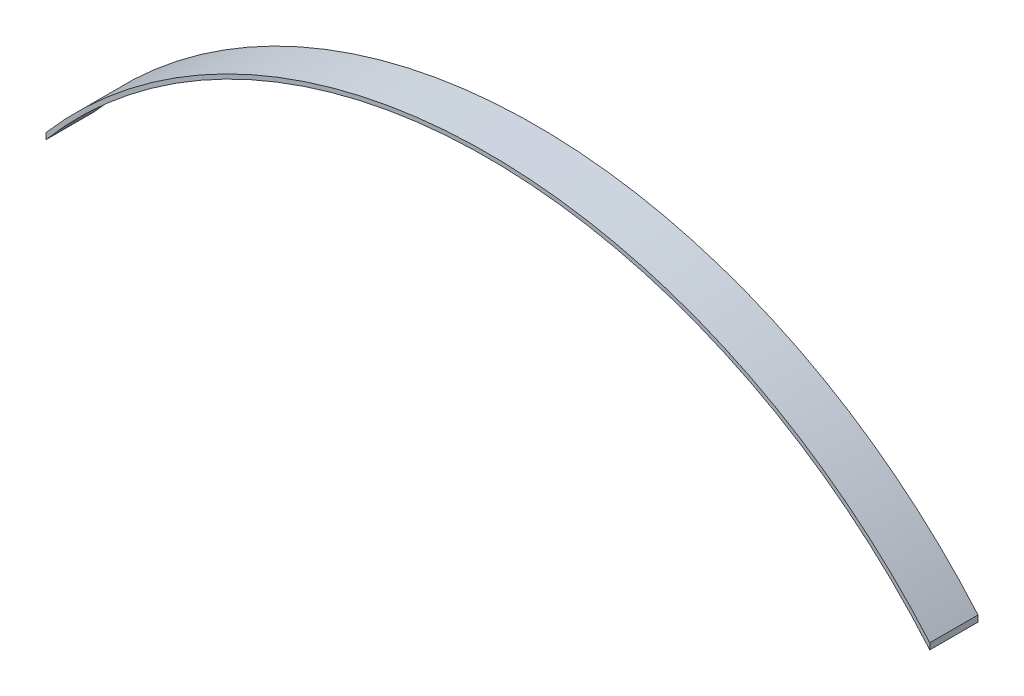
ISO-10303-21;
HEADER;
FILE_DESCRIPTION(('STEP AP214'),'2;1');
FILE_NAME('part.step','',(''),(''),'','','');
FILE_SCHEMA(('AUTOMOTIVE_DESIGN { 1 0 10303 214 1 1 1 1 }'));
ENDSEC;
DATA;
#1=APPLICATION_CONTEXT('core data for automotive mechanical design processes');
#2=APPLICATION_PROTOCOL_DEFINITION('international standard','automotive_design',2000,#1);
#3=PRODUCT_CONTEXT('',#1,'mechanical');
#4=PRODUCT('Part','Part','',(#3));
#5=PRODUCT_RELATED_PRODUCT_CATEGORY('part','',(#4));
#6=PRODUCT_DEFINITION_FORMATION('','',#4);
#7=PRODUCT_DEFINITION_CONTEXT('part definition',#1,'design');
#8=PRODUCT_DEFINITION('design','',#6,#7);
#9=PRODUCT_DEFINITION_SHAPE('','',#8);
#10=(LENGTH_UNIT() NAMED_UNIT(*) SI_UNIT(.MILLI.,.METRE.));
#11=(NAMED_UNIT(*) PLANE_ANGLE_UNIT() SI_UNIT($,.RADIAN.));
#12=(NAMED_UNIT(*) SI_UNIT($,.STERADIAN.) SOLID_ANGLE_UNIT());
#13=UNCERTAINTY_MEASURE_WITH_UNIT(LENGTH_MEASURE(1.E-05),#10,'distance_accuracy_value','');
#14=(GEOMETRIC_REPRESENTATION_CONTEXT(3) GLOBAL_UNCERTAINTY_ASSIGNED_CONTEXT((#13)) GLOBAL_UNIT_ASSIGNED_CONTEXT((#10,
#11,#12)) REPRESENTATION_CONTEXT('',''));
#15=CARTESIAN_POINT('',(0.,0.,0.));
#16=DIRECTION('',(0.,0.,1.));
#17=DIRECTION('',(1.,0.,0.));
#18=AXIS2_PLACEMENT_3D('',#15,#16,#17);
#19=CARTESIAN_POINT('',(0.,0.,12.));
#20=DIRECTION('',(0.,0.,-1.));
#21=DIRECTION('',(-1.,0.,0.));
#22=AXIS2_PLACEMENT_3D('',#19,#20,#21);
#23=CYLINDRICAL_SURFACE('',#22,145.);
#24=CARTESIAN_POINT('',(0.,0.,0.));
#25=DIRECTION('',(0.,0.,1.));
#26=DIRECTION('',(1.,0.,0.));
#27=AXIS2_PLACEMENT_3D('',#24,#25,#26);
#28=CIRCLE('',#27,145.);
#29=CARTESIAN_POINT('',(110.,94.4722181384559,0.));
#30=VERTEX_POINT('',#29);
#31=CARTESIAN_POINT('',(-110.,94.4722181384559,0.));
#32=VERTEX_POINT('',#31);
#33=EDGE_CURVE('E97',#30,#32,#28,.T.);
#34=ORIENTED_EDGE('',*,*,#33,.T.);
#35=DIRECTION('',(0.,0.,-1.));
#36=VECTOR('',#35,1.);
#37=CARTESIAN_POINT('',(-110.,94.4722181384559,12.));
#38=LINE('',#37,#36);
#39=CARTESIAN_POINT('',(-110.,94.4722181384559,12.));
#40=VERTEX_POINT('',#39);
#41=EDGE_CURVE('E11',#40,#32,#38,.T.);
#42=ORIENTED_EDGE('',*,*,#41,.F.);
#43=CARTESIAN_POINT('',(0.,0.,12.));
#44=DIRECTION('',(0.,0.,1.));
#45=DIRECTION('',(1.,0.,0.));
#46=AXIS2_PLACEMENT_3D('',#43,#44,#45);
#47=CIRCLE('',#46,145.);
#48=CARTESIAN_POINT('',(110.,94.4722181384559,12.));
#49=VERTEX_POINT('',#48);
#50=EDGE_CURVE('E85',#49,#40,#47,.T.);
#51=ORIENTED_EDGE('',*,*,#50,.F.);
#52=DIRECTION('',(0.,0.,-1.));
#53=VECTOR('',#52,1.);
#54=CARTESIAN_POINT('',(110.,94.4722181384559,12.));
#55=LINE('',#54,#53);
#56=EDGE_CURVE('E93',#49,#30,#55,.T.);
#57=ORIENTED_EDGE('',*,*,#56,.T.);
#58=EDGE_LOOP('',(#34,#42,#51,#57));
#59=FACE_BOUND('',#58,.T.);
#60=ADVANCED_FACE('F34',(#59),#23,.T.);
#61=CARTESIAN_POINT('',(-110.,94.4722181384559,12.));
#62=DIRECTION('',(1.,0.,0.));
#63=DIRECTION('',(0.,0.,-1.));
#64=AXIS2_PLACEMENT_3D('',#61,#62,#63);
#65=PLANE('',#64);
#66=DIRECTION('',(0.,-1.,0.));
#67=VECTOR('',#66,1.);
#68=CARTESIAN_POINT('',(-110.,94.4722181384559,0.));
#69=LINE('',#68,#67);
#70=CARTESIAN_POINT('',(-110.,92.9300812439115,0.));
#71=VERTEX_POINT('',#70);
#72=EDGE_CURVE('E89',#32,#71,#69,.T.);
#73=ORIENTED_EDGE('',*,*,#72,.T.);
#74=DIRECTION('',(0.,0.,-1.));
#75=VECTOR('',#74,1.);
#76=CARTESIAN_POINT('',(-110.,92.9300812439115,12.));
#77=LINE('',#76,#75);
#78=CARTESIAN_POINT('',(-110.,92.9300812439115,12.));
#79=VERTEX_POINT('',#78);
#80=EDGE_CURVE('E42',#79,#71,#77,.T.);
#81=ORIENTED_EDGE('',*,*,#80,.F.);
#82=DIRECTION('',(0.,-1.,0.));
#83=VECTOR('',#82,1.);
#84=CARTESIAN_POINT('',(-110.,94.4722181384559,12.));
#85=LINE('',#84,#83);
#86=EDGE_CURVE('E80',#40,#79,#85,.T.);
#87=ORIENTED_EDGE('',*,*,#86,.F.);
#88=ORIENTED_EDGE('',*,*,#41,.T.);
#89=EDGE_LOOP('',(#73,#81,#87,#88));
#90=FACE_BOUND('',#89,.T.);
#91=ADVANCED_FACE('F88',(#90),#65,.F.);
#92=CARTESIAN_POINT('',(0.,0.,12.));
#93=DIRECTION('',(0.,0.,-1.));
#94=DIRECTION('',(-1.,0.,0.));
#95=AXIS2_PLACEMENT_3D('',#92,#93,#94);
#96=CYLINDRICAL_SURFACE('',#95,144.);
#97=CARTESIAN_POINT('',(0.,0.,0.));
#98=DIRECTION('',(0.,0.,-1.));
#99=DIRECTION('',(1.,0.,0.));
#100=AXIS2_PLACEMENT_3D('',#97,#98,#99);
#101=CIRCLE('',#100,144.);
#102=CARTESIAN_POINT('',(110.,92.9300812439115,0.));
#103=VERTEX_POINT('',#102);
#104=EDGE_CURVE('E67',#71,#103,#101,.T.);
#105=ORIENTED_EDGE('',*,*,#104,.T.);
#106=DIRECTION('',(0.,0.,-1.));
#107=VECTOR('',#106,1.);
#108=CARTESIAN_POINT('',(110.,92.9300812439115,12.));
#109=LINE('',#108,#107);
#110=CARTESIAN_POINT('',(110.,92.9300812439115,12.));
#111=VERTEX_POINT('',#110);
#112=EDGE_CURVE('E90',#111,#103,#109,.T.);
#113=ORIENTED_EDGE('',*,*,#112,.F.);
#114=CARTESIAN_POINT('',(0.,0.,12.));
#115=DIRECTION('',(0.,0.,-1.));
#116=DIRECTION('',(1.,0.,0.));
#117=AXIS2_PLACEMENT_3D('',#114,#115,#116);
#118=CIRCLE('',#117,144.);
#119=EDGE_CURVE('E83',#79,#111,#118,.T.);
#120=ORIENTED_EDGE('',*,*,#119,.F.);
#121=ORIENTED_EDGE('',*,*,#80,.T.);
#122=EDGE_LOOP('',(#105,#113,#120,#121));
#123=FACE_BOUND('',#122,.T.);
#124=ADVANCED_FACE('F91',(#123),#96,.F.);
#125=CARTESIAN_POINT('',(110.,94.4722181384559,12.));
#126=DIRECTION('',(-1.,0.,0.));
#127=DIRECTION('',(0.,-1.,0.));
#128=AXIS2_PLACEMENT_3D('',#125,#126,#127);
#129=PLANE('',#128);
#130=DIRECTION('',(0.,1.,0.));
#131=VECTOR('',#130,1.);
#132=CARTESIAN_POINT('',(110.,94.4722181384559,0.));
#133=LINE('',#132,#131);
#134=EDGE_CURVE('E73',#103,#30,#133,.T.);
#135=ORIENTED_EDGE('',*,*,#134,.T.);
#136=ORIENTED_EDGE('',*,*,#56,.F.);
#137=DIRECTION('',(0.,1.,0.));
#138=VECTOR('',#137,1.);
#139=CARTESIAN_POINT('',(110.,94.4722181384559,12.));
#140=LINE('',#139,#138);
#141=EDGE_CURVE('E50',#111,#49,#140,.T.);
#142=ORIENTED_EDGE('',*,*,#141,.F.);
#143=ORIENTED_EDGE('',*,*,#112,.T.);
#144=EDGE_LOOP('',(#135,#136,#142,#143));
#145=FACE_BOUND('',#144,.T.);
#146=ADVANCED_FACE('F104',(#145),#129,.F.);
#147=CARTESIAN_POINT('',(0.,0.,12.));
#148=DIRECTION('',(0.,0.,1.));
#149=DIRECTION('',(1.,0.,0.));
#150=AXIS2_PLACEMENT_3D('',#147,#148,#149);
#151=PLANE('',#150);
#152=ORIENTED_EDGE('',*,*,#50,.T.);
#153=ORIENTED_EDGE('',*,*,#86,.T.);
#154=ORIENTED_EDGE('',*,*,#119,.T.);
#155=ORIENTED_EDGE('',*,*,#141,.T.);
#156=EDGE_LOOP('',(#152,#153,#154,#155));
#157=FACE_BOUND('',#156,.T.);
#158=ADVANCED_FACE('F81',(#157),#151,.T.);
#159=CARTESIAN_POINT('',(0.,0.,0.));
#160=DIRECTION('',(0.,0.,1.));
#161=DIRECTION('',(1.,0.,0.));
#162=AXIS2_PLACEMENT_3D('',#159,#160,#161);
#163=PLANE('',#162);
#164=ORIENTED_EDGE('',*,*,#33,.F.);
#165=ORIENTED_EDGE('',*,*,#134,.F.);
#166=ORIENTED_EDGE('',*,*,#104,.F.);
#167=ORIENTED_EDGE('',*,*,#72,.F.);
#168=EDGE_LOOP('',(#164,#165,#166,#167));
#169=FACE_BOUND('',#168,.T.);
#170=ADVANCED_FACE('F107',(#169),#163,.F.);
#171=CLOSED_SHELL('',(#60,#91,#124,#146,#158,#170));
#172=MANIFOLD_SOLID_BREP('B2',#171);
#173=ADVANCED_BREP_SHAPE_REPRESENTATION('',(#18,#172),#14);
#174=SHAPE_DEFINITION_REPRESENTATION(#9,#173);
ENDSEC;
END-ISO-10303-21;
